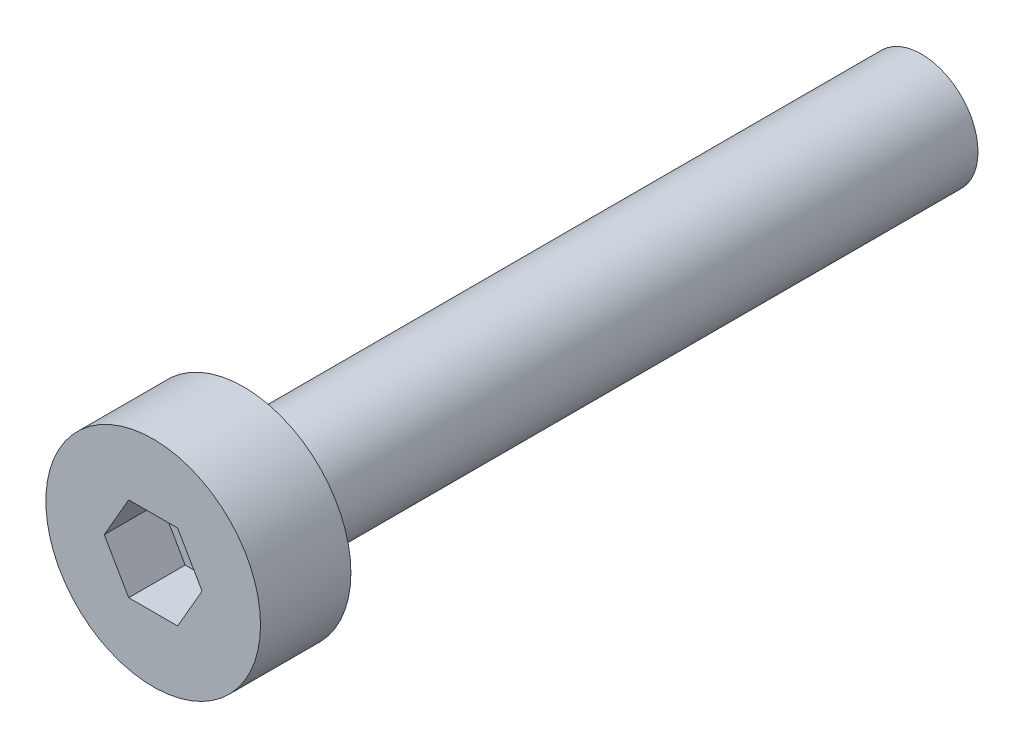
ISO-10303-21;
HEADER;
FILE_DESCRIPTION(('STEP AP214'),'2;1');
FILE_NAME('part.step','',(''),(''),'','','');
FILE_SCHEMA(('AUTOMOTIVE_DESIGN { 1 0 10303 214 1 1 1 1 }'));
ENDSEC;
DATA;
#1=APPLICATION_CONTEXT('core data for automotive mechanical design processes');
#2=APPLICATION_PROTOCOL_DEFINITION('international standard','automotive_design',2000,#1);
#3=PRODUCT_CONTEXT('',#1,'mechanical');
#4=PRODUCT('Part','Part','',(#3));
#5=PRODUCT_RELATED_PRODUCT_CATEGORY('part','',(#4));
#6=PRODUCT_DEFINITION_FORMATION('','',#4);
#7=PRODUCT_DEFINITION_CONTEXT('part definition',#1,'design');
#8=PRODUCT_DEFINITION('design','',#6,#7);
#9=PRODUCT_DEFINITION_SHAPE('','',#8);
#10=(LENGTH_UNIT() NAMED_UNIT(*) SI_UNIT(.MILLI.,.METRE.));
#11=(NAMED_UNIT(*) PLANE_ANGLE_UNIT() SI_UNIT($,.RADIAN.));
#12=(NAMED_UNIT(*) SI_UNIT($,.STERADIAN.) SOLID_ANGLE_UNIT());
#13=UNCERTAINTY_MEASURE_WITH_UNIT(LENGTH_MEASURE(1.E-05),#10,'distance_accuracy_value','');
#14=(GEOMETRIC_REPRESENTATION_CONTEXT(3) GLOBAL_UNCERTAINTY_ASSIGNED_CONTEXT((#13)) GLOBAL_UNIT_ASSIGNED_CONTEXT((#10,
#11,#12)) REPRESENTATION_CONTEXT('',''));
#15=CARTESIAN_POINT('',(0.,0.,0.));
#16=DIRECTION('',(0.,0.,1.));
#17=DIRECTION('',(1.,0.,0.));
#18=AXIS2_PLACEMENT_3D('',#15,#16,#17);
#19=CARTESIAN_POINT('',(0.,0.,12.));
#20=DIRECTION('',(0.,0.,-1.));
#21=DIRECTION('',(-1.,0.,0.));
#22=AXIS2_PLACEMENT_3D('',#19,#20,#21);
#23=CYLINDRICAL_SURFACE('',#22,1.);
#24=CARTESIAN_POINT('',(0.,0.,12.));
#25=DIRECTION('',(0.,0.,1.));
#26=DIRECTION('',(1.,0.,0.));
#27=AXIS2_PLACEMENT_3D('',#24,#25,#26);
#28=CIRCLE('',#27,1.);
#29=CARTESIAN_POINT('',(1.,0.,12.));
#30=VERTEX_POINT('',#29);
#31=EDGE_CURVE('E11',#30,#30,#28,.T.);
#32=ORIENTED_EDGE('',*,*,#31,.F.);
#33=EDGE_LOOP('',(#32));
#34=FACE_BOUND('',#33,.T.);
#35=CARTESIAN_POINT('',(0.,0.,0.));
#36=DIRECTION('',(0.,0.,1.));
#37=DIRECTION('',(1.,0.,0.));
#38=AXIS2_PLACEMENT_3D('',#35,#36,#37);
#39=CIRCLE('',#38,1.);
#40=CARTESIAN_POINT('',(1.,0.,0.));
#41=VERTEX_POINT('',#40);
#42=EDGE_CURVE('E37',#41,#41,#39,.T.);
#43=ORIENTED_EDGE('',*,*,#42,.T.);
#44=EDGE_LOOP('',(#43));
#45=FACE_BOUND('',#44,.T.);
#46=ADVANCED_FACE('F34',(#34,#45),#23,.T.);
#47=CARTESIAN_POINT('',(0.,0.,0.));
#48=DIRECTION('',(0.,0.,1.));
#49=DIRECTION('',(1.,0.,0.));
#50=AXIS2_PLACEMENT_3D('',#47,#48,#49);
#51=PLANE('',#50);
#52=ORIENTED_EDGE('',*,*,#42,.F.);
#53=EDGE_LOOP('',(#52));
#54=FACE_BOUND('',#53,.T.);
#55=ADVANCED_FACE('F165',(#54),#51,.F.);
#56=CARTESIAN_POINT('',(0.,0.,13.6));
#57=DIRECTION('',(0.,0.,-1.));
#58=DIRECTION('',(-1.,0.,0.));
#59=AXIS2_PLACEMENT_3D('',#56,#57,#58);
#60=CYLINDRICAL_SURFACE('',#59,1.9);
#61=CARTESIAN_POINT('',(0.,0.,13.6));
#62=DIRECTION('',(0.,0.,1.));
#63=DIRECTION('',(1.,0.,0.));
#64=AXIS2_PLACEMENT_3D('',#61,#62,#63);
#65=CIRCLE('',#64,1.9);
#66=CARTESIAN_POINT('',(1.9,0.,13.6));
#67=VERTEX_POINT('',#66);
#68=EDGE_CURVE('E141',#67,#67,#65,.T.);
#69=ORIENTED_EDGE('',*,*,#68,.F.);
#70=EDGE_LOOP('',(#69));
#71=FACE_BOUND('',#70,.T.);
#72=CARTESIAN_POINT('',(0.,0.,12.));
#73=DIRECTION('',(0.,0.,1.));
#74=DIRECTION('',(1.,0.,0.));
#75=AXIS2_PLACEMENT_3D('',#72,#73,#74);
#76=CIRCLE('',#75,1.9);
#77=CARTESIAN_POINT('',(1.9,0.,12.));
#78=VERTEX_POINT('',#77);
#79=EDGE_CURVE('E135',#78,#78,#76,.T.);
#80=ORIENTED_EDGE('',*,*,#79,.T.);
#81=EDGE_LOOP('',(#80));
#82=FACE_BOUND('',#81,.T.);
#83=ADVANCED_FACE('F147',(#71,#82),#60,.T.);
#84=CARTESIAN_POINT('',(0.,0.,13.6));
#85=DIRECTION('',(0.,0.,1.));
#86=DIRECTION('',(1.,0.,0.));
#87=AXIS2_PLACEMENT_3D('',#84,#85,#86);
#88=PLANE('',#87);
#89=DIRECTION('',(0.499999999999999,0.866025403784439,0.));
#90=VECTOR('',#89,1.);
#91=CARTESIAN_POINT('',(0.433012701892219,-0.750000000000001,13.6));
#92=LINE('',#91,#90);
#93=CARTESIAN_POINT('',(0.433012701892219,-0.750000000000001,13.6));
#94=VERTEX_POINT('',#93);
#95=CARTESIAN_POINT('',(0.866025403784439,0.,13.6));
#96=VERTEX_POINT('',#95);
#97=EDGE_CURVE('E48',#94,#96,#92,.T.);
#98=ORIENTED_EDGE('',*,*,#97,.F.);
#99=DIRECTION('',(1.,0.,0.));
#100=VECTOR('',#99,1.);
#101=CARTESIAN_POINT('',(-0.43301270189222,-0.750000000000001,13.6));
#102=LINE('',#101,#100);
#103=CARTESIAN_POINT('',(-0.43301270189222,-0.750000000000001,13.6));
#104=VERTEX_POINT('',#103);
#105=EDGE_CURVE('E131',#104,#94,#102,.T.);
#106=ORIENTED_EDGE('',*,*,#105,.F.);
#107=DIRECTION('',(0.5,-0.866025403784439,0.));
#108=VECTOR('',#107,1.);
#109=CARTESIAN_POINT('',(-0.866025403784439,0.,13.6));
#110=LINE('',#109,#108);
#111=CARTESIAN_POINT('',(-0.866025403784439,0.,13.6));
#112=VERTEX_POINT('',#111);
#113=EDGE_CURVE('E129',#112,#104,#110,.T.);
#114=ORIENTED_EDGE('',*,*,#113,.F.);
#115=DIRECTION('',(-0.5,-0.866025403784439,0.));
#116=VECTOR('',#115,1.);
#117=CARTESIAN_POINT('',(-0.43301270189222,0.750000000000001,13.6));
#118=LINE('',#117,#116);
#119=CARTESIAN_POINT('',(-0.43301270189222,0.750000000000001,13.6));
#120=VERTEX_POINT('',#119);
#121=EDGE_CURVE('E96',#120,#112,#118,.T.);
#122=ORIENTED_EDGE('',*,*,#121,.F.);
#123=DIRECTION('',(-1.,0.,0.));
#124=VECTOR('',#123,1.);
#125=CARTESIAN_POINT('',(0.433012701892219,0.750000000000001,13.6));
#126=LINE('',#125,#124);
#127=CARTESIAN_POINT('',(0.433012701892219,0.750000000000001,13.6));
#128=VERTEX_POINT('',#127);
#129=EDGE_CURVE('E125',#128,#120,#126,.T.);
#130=ORIENTED_EDGE('',*,*,#129,.F.);
#131=DIRECTION('',(-0.5,0.866025403784438,0.));
#132=VECTOR('',#131,1.);
#133=CARTESIAN_POINT('',(0.866025403784439,0.,13.6));
#134=LINE('',#133,#132);
#135=EDGE_CURVE('E122',#96,#128,#134,.T.);
#136=ORIENTED_EDGE('',*,*,#135,.F.);
#137=EDGE_LOOP('',(#98,#106,#114,#122,#130,#136));
#138=FACE_BOUND('',#137,.T.);
#139=ORIENTED_EDGE('',*,*,#68,.T.);
#140=EDGE_LOOP('',(#139));
#141=FACE_BOUND('',#140,.T.);
#142=ADVANCED_FACE('F152',(#138,#141),#88,.T.);
#143=CARTESIAN_POINT('',(0.,0.,12.));
#144=DIRECTION('',(0.,0.,1.));
#145=DIRECTION('',(1.,0.,0.));
#146=AXIS2_PLACEMENT_3D('',#143,#144,#145);
#147=PLANE('',#146);
#148=ORIENTED_EDGE('',*,*,#31,.T.);
#149=EDGE_LOOP('',(#148));
#150=FACE_BOUND('',#149,.T.);
#151=ORIENTED_EDGE('',*,*,#79,.F.);
#152=EDGE_LOOP('',(#151));
#153=FACE_BOUND('',#152,.T.);
#154=ADVANCED_FACE('F149',(#150,#153),#147,.F.);
#155=CARTESIAN_POINT('',(0.433012701892219,-0.750000000000001,12.6));
#156=DIRECTION('',(0.866025403784439,-0.5,0.));
#157=DIRECTION('',(0.499999999999999,0.866025403784439,0.));
#158=AXIS2_PLACEMENT_3D('',#155,#156,#157);
#159=PLANE('',#158);
#160=ORIENTED_EDGE('',*,*,#97,.T.);
#161=DIRECTION('',(0.,0.,1.));
#162=VECTOR('',#161,1.);
#163=CARTESIAN_POINT('',(0.866025403784439,0.,12.6));
#164=LINE('',#163,#162);
#165=CARTESIAN_POINT('',(0.866025403784439,0.,12.6));
#166=VERTEX_POINT('',#165);
#167=EDGE_CURVE('E78',#166,#96,#164,.T.);
#168=ORIENTED_EDGE('',*,*,#167,.F.);
#169=DIRECTION('',(0.499999999999999,0.866025403784439,0.));
#170=VECTOR('',#169,1.);
#171=CARTESIAN_POINT('',(0.433012701892219,-0.750000000000001,12.6));
#172=LINE('',#171,#170);
#173=CARTESIAN_POINT('',(0.433012701892219,-0.750000000000001,12.6));
#174=VERTEX_POINT('',#173);
#175=EDGE_CURVE('E133',#174,#166,#172,.T.);
#176=ORIENTED_EDGE('',*,*,#175,.F.);
#177=DIRECTION('',(0.,0.,1.));
#178=VECTOR('',#177,1.);
#179=CARTESIAN_POINT('',(0.433012701892219,-0.750000000000001,12.6));
#180=LINE('',#179,#178);
#181=EDGE_CURVE('E56',#174,#94,#180,.T.);
#182=ORIENTED_EDGE('',*,*,#181,.T.);
#183=EDGE_LOOP('',(#160,#168,#176,#182));
#184=FACE_BOUND('',#183,.T.);
#185=ADVANCED_FACE('F151',(#184),#159,.F.);
#186=CARTESIAN_POINT('',(-0.43301270189222,-0.750000000000001,12.6));
#187=DIRECTION('',(0.,-1.,0.));
#188=DIRECTION('',(1.,0.,0.));
#189=AXIS2_PLACEMENT_3D('',#186,#187,#188);
#190=PLANE('',#189);
#191=ORIENTED_EDGE('',*,*,#105,.T.);
#192=ORIENTED_EDGE('',*,*,#181,.F.);
#193=DIRECTION('',(1.,0.,0.));
#194=VECTOR('',#193,1.);
#195=CARTESIAN_POINT('',(-0.43301270189222,-0.750000000000001,12.6));
#196=LINE('',#195,#194);
#197=CARTESIAN_POINT('',(-0.43301270189222,-0.750000000000001,12.6));
#198=VERTEX_POINT('',#197);
#199=EDGE_CURVE('E108',#198,#174,#196,.T.);
#200=ORIENTED_EDGE('',*,*,#199,.F.);
#201=DIRECTION('',(0.,0.,1.));
#202=VECTOR('',#201,1.);
#203=CARTESIAN_POINT('',(-0.43301270189222,-0.750000000000001,12.6));
#204=LINE('',#203,#202);
#205=EDGE_CURVE('E100',#198,#104,#204,.T.);
#206=ORIENTED_EDGE('',*,*,#205,.T.);
#207=EDGE_LOOP('',(#191,#192,#200,#206));
#208=FACE_BOUND('',#207,.T.);
#209=ADVANCED_FACE('F159',(#208),#190,.F.);
#210=CARTESIAN_POINT('',(-0.866025403784439,0.,12.6));
#211=DIRECTION('',(-0.866025403784439,-0.5,0.));
#212=DIRECTION('',(0.5,-0.866025403784439,0.));
#213=AXIS2_PLACEMENT_3D('',#210,#211,#212);
#214=PLANE('',#213);
#215=ORIENTED_EDGE('',*,*,#113,.T.);
#216=ORIENTED_EDGE('',*,*,#205,.F.);
#217=DIRECTION('',(0.5,-0.866025403784439,0.));
#218=VECTOR('',#217,1.);
#219=CARTESIAN_POINT('',(-0.866025403784439,0.,12.6));
#220=LINE('',#219,#218);
#221=CARTESIAN_POINT('',(-0.866025403784439,0.,12.6));
#222=VERTEX_POINT('',#221);
#223=EDGE_CURVE('E104',#222,#198,#220,.T.);
#224=ORIENTED_EDGE('',*,*,#223,.F.);
#225=DIRECTION('',(0.,0.,1.));
#226=VECTOR('',#225,1.);
#227=CARTESIAN_POINT('',(-0.866025403784439,0.,12.6));
#228=LINE('',#227,#226);
#229=EDGE_CURVE('E89',#222,#112,#228,.T.);
#230=ORIENTED_EDGE('',*,*,#229,.T.);
#231=EDGE_LOOP('',(#215,#216,#224,#230));
#232=FACE_BOUND('',#231,.T.);
#233=ADVANCED_FACE('F105',(#232),#214,.F.);
#234=CARTESIAN_POINT('',(-0.43301270189222,0.750000000000001,12.6));
#235=DIRECTION('',(-0.866025403784439,0.5,0.));
#236=DIRECTION('',(-0.5,-0.866025403784439,0.));
#237=AXIS2_PLACEMENT_3D('',#234,#235,#236);
#238=PLANE('',#237);
#239=ORIENTED_EDGE('',*,*,#121,.T.);
#240=ORIENTED_EDGE('',*,*,#229,.F.);
#241=DIRECTION('',(-0.5,-0.866025403784439,0.));
#242=VECTOR('',#241,1.);
#243=CARTESIAN_POINT('',(-0.43301270189222,0.750000000000001,12.6));
#244=LINE('',#243,#242);
#245=CARTESIAN_POINT('',(-0.43301270189222,0.750000000000001,12.6));
#246=VERTEX_POINT('',#245);
#247=EDGE_CURVE('E93',#246,#222,#244,.T.);
#248=ORIENTED_EDGE('',*,*,#247,.F.);
#249=DIRECTION('',(0.,0.,1.));
#250=VECTOR('',#249,1.);
#251=CARTESIAN_POINT('',(-0.43301270189222,0.750000000000001,12.6));
#252=LINE('',#251,#250);
#253=EDGE_CURVE('E101',#246,#120,#252,.T.);
#254=ORIENTED_EDGE('',*,*,#253,.T.);
#255=EDGE_LOOP('',(#239,#240,#248,#254));
#256=FACE_BOUND('',#255,.T.);
#257=ADVANCED_FACE('F91',(#256),#238,.F.);
#258=CARTESIAN_POINT('',(0.433012701892219,0.750000000000001,12.6));
#259=DIRECTION('',(0.,1.,0.));
#260=DIRECTION('',(0.,0.,1.));
#261=AXIS2_PLACEMENT_3D('',#258,#259,#260);
#262=PLANE('',#261);
#263=ORIENTED_EDGE('',*,*,#129,.T.);
#264=ORIENTED_EDGE('',*,*,#253,.F.);
#265=DIRECTION('',(-1.,0.,0.));
#266=VECTOR('',#265,1.);
#267=CARTESIAN_POINT('',(0.433012701892219,0.750000000000001,12.6));
#268=LINE('',#267,#266);
#269=CARTESIAN_POINT('',(0.433012701892219,0.750000000000001,12.6));
#270=VERTEX_POINT('',#269);
#271=EDGE_CURVE('E114',#270,#246,#268,.T.);
#272=ORIENTED_EDGE('',*,*,#271,.F.);
#273=DIRECTION('',(0.,0.,1.));
#274=VECTOR('',#273,1.);
#275=CARTESIAN_POINT('',(0.433012701892219,0.750000000000001,12.6));
#276=LINE('',#275,#274);
#277=EDGE_CURVE('E138',#270,#128,#276,.T.);
#278=ORIENTED_EDGE('',*,*,#277,.T.);
#279=EDGE_LOOP('',(#263,#264,#272,#278));
#280=FACE_BOUND('',#279,.T.);
#281=ADVANCED_FACE('F220',(#280),#262,.F.);
#282=CARTESIAN_POINT('',(0.866025403784439,0.,12.6));
#283=DIRECTION('',(0.866025403784438,0.5,0.));
#284=DIRECTION('',(-0.5,0.866025403784439,0.));
#285=AXIS2_PLACEMENT_3D('',#282,#283,#284);
#286=PLANE('',#285);
#287=ORIENTED_EDGE('',*,*,#135,.T.);
#288=ORIENTED_EDGE('',*,*,#277,.F.);
#289=DIRECTION('',(-0.5,0.866025403784438,0.));
#290=VECTOR('',#289,1.);
#291=CARTESIAN_POINT('',(0.866025403784439,0.,12.6));
#292=LINE('',#291,#290);
#293=EDGE_CURVE('E116',#166,#270,#292,.T.);
#294=ORIENTED_EDGE('',*,*,#293,.F.);
#295=ORIENTED_EDGE('',*,*,#167,.T.);
#296=EDGE_LOOP('',(#287,#288,#294,#295));
#297=FACE_BOUND('',#296,.T.);
#298=ADVANCED_FACE('F229',(#297),#286,.F.);
#299=CARTESIAN_POINT('',(0.,0.,12.6));
#300=DIRECTION('',(0.,0.,1.));
#301=DIRECTION('',(1.,0.,0.));
#302=AXIS2_PLACEMENT_3D('',#299,#300,#301);
#303=PLANE('',#302);
#304=ORIENTED_EDGE('',*,*,#175,.T.);
#305=ORIENTED_EDGE('',*,*,#293,.T.);
#306=ORIENTED_EDGE('',*,*,#271,.T.);
#307=ORIENTED_EDGE('',*,*,#247,.T.);
#308=ORIENTED_EDGE('',*,*,#223,.T.);
#309=ORIENTED_EDGE('',*,*,#199,.T.);
#310=EDGE_LOOP('',(#304,#305,#306,#307,#308,#309));
#311=FACE_BOUND('',#310,.T.);
#312=ADVANCED_FACE('F111',(#311),#303,.T.);
#313=CLOSED_SHELL('',(#46,#55,#83,#142,#154,#185,#209,#233,#257,#281,#298,#312));
#314=MANIFOLD_SOLID_BREP('B2',#313);
#315=ADVANCED_BREP_SHAPE_REPRESENTATION('',(#18,#314),#14);
#316=SHAPE_DEFINITION_REPRESENTATION(#9,#315);
ENDSEC;
END-ISO-10303-21;
